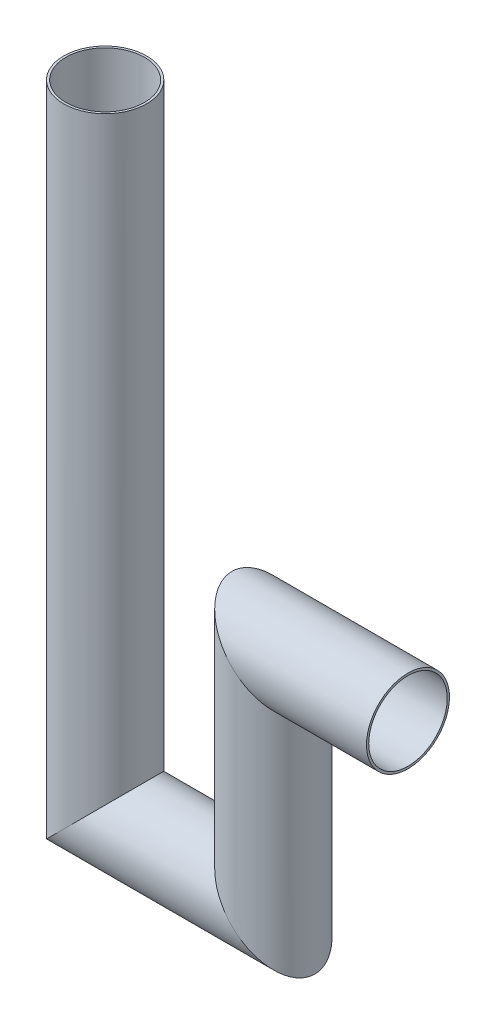
ISO-10303-21;
HEADER;
FILE_DESCRIPTION(('STEP AP214'),'2;1');
FILE_NAME('part.step','',(''),(''),'','','');
FILE_SCHEMA(('AUTOMOTIVE_DESIGN { 1 0 10303 214 1 1 1 1 }'));
ENDSEC;
DATA;
#1=APPLICATION_CONTEXT('core data for automotive mechanical design processes');
#2=APPLICATION_PROTOCOL_DEFINITION('international standard','automotive_design',2000,#1);
#3=PRODUCT_CONTEXT('',#1,'mechanical');
#4=PRODUCT('Part','Part','',(#3));
#5=PRODUCT_RELATED_PRODUCT_CATEGORY('part','',(#4));
#6=PRODUCT_DEFINITION_FORMATION('','',#4);
#7=PRODUCT_DEFINITION_CONTEXT('part definition',#1,'design');
#8=PRODUCT_DEFINITION('design','',#6,#7);
#9=PRODUCT_DEFINITION_SHAPE('','',#8);
#10=(LENGTH_UNIT() NAMED_UNIT(*) SI_UNIT(.MILLI.,.METRE.));
#11=(NAMED_UNIT(*) PLANE_ANGLE_UNIT() SI_UNIT($,.RADIAN.));
#12=(NAMED_UNIT(*) SI_UNIT($,.STERADIAN.) SOLID_ANGLE_UNIT());
#13=UNCERTAINTY_MEASURE_WITH_UNIT(LENGTH_MEASURE(1.E-05),#10,'distance_accuracy_value','');
#14=(GEOMETRIC_REPRESENTATION_CONTEXT(3) GLOBAL_UNCERTAINTY_ASSIGNED_CONTEXT((#13)) GLOBAL_UNIT_ASSIGNED_CONTEXT((#10,
#11,#12)) REPRESENTATION_CONTEXT('',''));
#15=CARTESIAN_POINT('',(0.,0.,0.));
#16=DIRECTION('',(0.,0.,1.));
#17=DIRECTION('',(1.,0.,0.));
#18=AXIS2_PLACEMENT_3D('',#15,#16,#17);
#19=CARTESIAN_POINT('',(87.0219999999998,-457.2,0.));
#20=DIRECTION('',(1.,0.,0.));
#21=DIRECTION('',(0.,0.,-1.));
#22=AXIS2_PLACEMENT_3D('',#19,#20,#21);
#23=CYLINDRICAL_SURFACE('',#22,46.99);
#24=CARTESIAN_POINT('',(190.5,-457.2,0.));
#25=DIRECTION('',(0.707106781186548,0.707106781186548,0.));
#26=DIRECTION('',(-0.707106781186548,0.707106781186548,0.));
#27=AXIS2_PLACEMENT_3D('',#24,#25,#26);
#28=ELLIPSE('',#27,66.4538952959117,46.99);
#29=CARTESIAN_POINT('',(143.51,-410.21,0.));
#30=VERTEX_POINT('',#29);
#31=EDGE_CURVE('E40',#30,#30,#28,.T.);
#32=ORIENTED_EDGE('',*,*,#31,.T.);
#33=EDGE_LOOP('',(#32));
#34=FACE_BOUND('',#33,.T.);
#35=CARTESIAN_POINT('',(342.9,-457.2,0.));
#36=DIRECTION('',(-1.,0.,0.));
#37=DIRECTION('',(0.,0.,1.));
#38=AXIS2_PLACEMENT_3D('',#35,#36,#37);
#39=CIRCLE('',#38,46.99);
#40=CARTESIAN_POINT('',(342.9,-457.2,46.99));
#41=VERTEX_POINT('',#40);
#42=EDGE_CURVE('E69',#41,#41,#39,.T.);
#43=ORIENTED_EDGE('',*,*,#42,.T.);
#44=EDGE_LOOP('',(#43));
#45=FACE_BOUND('',#44,.T.);
#46=ADVANCED_FACE('F37',(#34,#45),#23,.T.);
#47=CARTESIAN_POINT('',(190.5,-814.678,0.));
#48=DIRECTION('',(0.,1.,0.));
#49=DIRECTION('',(0.,0.,1.));
#50=AXIS2_PLACEMENT_3D('',#47,#48,#49);
#51=CYLINDRICAL_SURFACE('',#50,46.99);
#52=CARTESIAN_POINT('',(190.5,-711.2,0.));
#53=DIRECTION('',(0.707106781186547,0.707106781186547,0.));
#54=DIRECTION('',(0.707106781186548,-0.707106781186548,0.));
#55=AXIS2_PLACEMENT_3D('',#52,#53,#54);
#56=ELLIPSE('',#55,66.4538952959118,46.99);
#57=CARTESIAN_POINT('',(237.49,-758.19,0.));
#58=VERTEX_POINT('',#57);
#59=EDGE_CURVE('E76',#58,#58,#56,.T.);
#60=ORIENTED_EDGE('',*,*,#59,.T.);
#61=EDGE_LOOP('',(#60));
#62=FACE_BOUND('',#61,.T.);
#63=ORIENTED_EDGE('',*,*,#31,.F.);
#64=EDGE_LOOP('',(#63));
#65=FACE_BOUND('',#64,.T.);
#66=ADVANCED_FACE('F87',(#62,#65),#51,.T.);
#67=CARTESIAN_POINT('',(-103.478,-711.2,0.));
#68=DIRECTION('',(1.,0.,0.));
#69=DIRECTION('',(0.,0.,-1.));
#70=AXIS2_PLACEMENT_3D('',#67,#68,#69);
#71=CYLINDRICAL_SURFACE('',#70,46.99);
#72=CARTESIAN_POINT('',(0.,-711.2,0.));
#73=DIRECTION('',(0.707106781186548,-0.707106781186548,0.));
#74=DIRECTION('',(-0.707106781186548,-0.707106781186548,0.));
#75=AXIS2_PLACEMENT_3D('',#72,#73,#74);
#76=ELLIPSE('',#75,66.4538952959117,46.99);
#77=CARTESIAN_POINT('',(-46.99,-758.19,0.));
#78=VERTEX_POINT('',#77);
#79=EDGE_CURVE('E73',#78,#78,#76,.T.);
#80=ORIENTED_EDGE('',*,*,#79,.T.);
#81=EDGE_LOOP('',(#80));
#82=FACE_BOUND('',#81,.T.);
#83=ORIENTED_EDGE('',*,*,#59,.F.);
#84=EDGE_LOOP('',(#83));
#85=FACE_BOUND('',#84,.T.);
#86=ADVANCED_FACE('F89',(#82,#85),#71,.T.);
#87=CARTESIAN_POINT('',(0.,0.,0.));
#88=DIRECTION('',(0.,-1.,0.));
#89=DIRECTION('',(0.,0.,-1.));
#90=AXIS2_PLACEMENT_3D('',#87,#88,#89);
#91=CYLINDRICAL_SURFACE('',#90,46.99);
#92=CARTESIAN_POINT('',(0.,0.,0.));
#93=DIRECTION('',(0.,1.,0.));
#94=DIRECTION('',(0.,0.,1.));
#95=AXIS2_PLACEMENT_3D('',#92,#93,#94);
#96=CIRCLE('',#95,46.99);
#97=CARTESIAN_POINT('',(0.,0.,46.99));
#98=VERTEX_POINT('',#97);
#99=EDGE_CURVE('E65',#98,#98,#96,.T.);
#100=ORIENTED_EDGE('',*,*,#99,.F.);
#101=EDGE_LOOP('',(#100));
#102=FACE_BOUND('',#101,.T.);
#103=ORIENTED_EDGE('',*,*,#79,.F.);
#104=EDGE_LOOP('',(#103));
#105=FACE_BOUND('',#104,.T.);
#106=ADVANCED_FACE('F94',(#102,#105),#91,.T.);
#107=CARTESIAN_POINT('',(342.9,-457.2,0.));
#108=DIRECTION('',(-1.,0.,0.));
#109=DIRECTION('',(0.,0.,1.));
#110=AXIS2_PLACEMENT_3D('',#107,#108,#109);
#111=PLANE('',#110);
#112=CARTESIAN_POINT('',(342.9,-457.2,0.));
#113=DIRECTION('',(-1.,0.,0.));
#114=DIRECTION('',(0.,0.,1.));
#115=AXIS2_PLACEMENT_3D('',#112,#113,#114);
#116=CIRCLE('',#115,44.45);
#117=CARTESIAN_POINT('',(342.9,-457.2,44.45));
#118=VERTEX_POINT('',#117);
#119=EDGE_CURVE('E61',#118,#118,#116,.F.);
#120=ORIENTED_EDGE('',*,*,#119,.F.);
#121=EDGE_LOOP('',(#120));
#122=FACE_BOUND('',#121,.T.);
#123=ORIENTED_EDGE('',*,*,#42,.F.);
#124=EDGE_LOOP('',(#123));
#125=FACE_BOUND('',#124,.T.);
#126=ADVANCED_FACE('F120',(#122,#125),#111,.F.);
#127=CARTESIAN_POINT('',(0.,0.,0.));
#128=DIRECTION('',(0.,1.,0.));
#129=DIRECTION('',(0.,0.,1.));
#130=AXIS2_PLACEMENT_3D('',#127,#128,#129);
#131=PLANE('',#130);
#132=CARTESIAN_POINT('',(0.,0.,0.));
#133=DIRECTION('',(0.,1.,0.));
#134=DIRECTION('',(0.,0.,1.));
#135=AXIS2_PLACEMENT_3D('',#132,#133,#134);
#136=CIRCLE('',#135,44.45);
#137=CARTESIAN_POINT('',(0.,0.,44.45));
#138=VERTEX_POINT('',#137);
#139=EDGE_CURVE('E45',#138,#138,#136,.F.);
#140=ORIENTED_EDGE('',*,*,#139,.T.);
#141=EDGE_LOOP('',(#140));
#142=FACE_BOUND('',#141,.T.);
#143=ORIENTED_EDGE('',*,*,#99,.T.);
#144=EDGE_LOOP('',(#143));
#145=FACE_BOUND('',#144,.T.);
#146=ADVANCED_FACE('F116',(#142,#145),#131,.T.);
#147=CARTESIAN_POINT('',(92.6099999999999,-457.2,0.));
#148=DIRECTION('',(1.,0.,0.));
#149=DIRECTION('',(0.,0.,-1.));
#150=AXIS2_PLACEMENT_3D('',#147,#148,#149);
#151=CYLINDRICAL_SURFACE('',#150,44.45);
#152=CARTESIAN_POINT('',(190.5,-457.2,0.));
#153=DIRECTION('',(0.707106781186547,0.707106781186547,0.));
#154=DIRECTION('',(-0.707106781186548,0.707106781186548,0.));
#155=AXIS2_PLACEMENT_3D('',#152,#153,#154);
#156=ELLIPSE('',#155,62.8617928474841,44.45);
#157=CARTESIAN_POINT('',(146.05,-412.75,0.));
#158=VERTEX_POINT('',#157);
#159=EDGE_CURVE('E57',#158,#158,#156,.F.);
#160=ORIENTED_EDGE('',*,*,#159,.T.);
#161=EDGE_LOOP('',(#160));
#162=FACE_BOUND('',#161,.T.);
#163=ORIENTED_EDGE('',*,*,#119,.T.);
#164=EDGE_LOOP('',(#163));
#165=FACE_BOUND('',#164,.T.);
#166=ADVANCED_FACE('F112',(#162,#165),#151,.F.);
#167=CARTESIAN_POINT('',(190.5,-809.09,0.));
#168=DIRECTION('',(0.,1.,0.));
#169=DIRECTION('',(0.,0.,1.));
#170=AXIS2_PLACEMENT_3D('',#167,#168,#169);
#171=CYLINDRICAL_SURFACE('',#170,44.45);
#172=CARTESIAN_POINT('',(190.5,-711.2,0.));
#173=DIRECTION('',(0.707106781186547,0.707106781186547,0.));
#174=DIRECTION('',(0.707106781186548,-0.707106781186548,0.));
#175=AXIS2_PLACEMENT_3D('',#172,#173,#174);
#176=ELLIPSE('',#175,62.8617928474841,44.45);
#177=CARTESIAN_POINT('',(234.95,-755.65,0.));
#178=VERTEX_POINT('',#177);
#179=EDGE_CURVE('E51',#178,#178,#176,.F.);
#180=ORIENTED_EDGE('',*,*,#179,.T.);
#181=EDGE_LOOP('',(#180));
#182=FACE_BOUND('',#181,.T.);
#183=ORIENTED_EDGE('',*,*,#159,.F.);
#184=EDGE_LOOP('',(#183));
#185=FACE_BOUND('',#184,.T.);
#186=ADVANCED_FACE('F105',(#182,#185),#171,.F.);
#187=CARTESIAN_POINT('',(-97.8899999999999,-711.2,0.));
#188=DIRECTION('',(1.,0.,0.));
#189=DIRECTION('',(0.,0.,-1.));
#190=AXIS2_PLACEMENT_3D('',#187,#188,#189);
#191=CYLINDRICAL_SURFACE('',#190,44.45);
#192=CARTESIAN_POINT('',(0.,-711.2,0.));
#193=DIRECTION('',(0.707106781186548,-0.707106781186548,0.));
#194=DIRECTION('',(-0.707106781186548,-0.707106781186548,0.));
#195=AXIS2_PLACEMENT_3D('',#192,#193,#194);
#196=ELLIPSE('',#195,62.8617928474841,44.45);
#197=CARTESIAN_POINT('',(-44.45,-755.65,0.));
#198=VERTEX_POINT('',#197);
#199=EDGE_CURVE('E10',#198,#198,#196,.F.);
#200=ORIENTED_EDGE('',*,*,#199,.T.);
#201=EDGE_LOOP('',(#200));
#202=FACE_BOUND('',#201,.T.);
#203=ORIENTED_EDGE('',*,*,#179,.F.);
#204=EDGE_LOOP('',(#203));
#205=FACE_BOUND('',#204,.T.);
#206=ADVANCED_FACE('F99',(#202,#205),#191,.F.);
#207=CARTESIAN_POINT('',(0.,0.,0.));
#208=DIRECTION('',(0.,-1.,0.));
#209=DIRECTION('',(0.,0.,-1.));
#210=AXIS2_PLACEMENT_3D('',#207,#208,#209);
#211=CYLINDRICAL_SURFACE('',#210,44.45);
#212=ORIENTED_EDGE('',*,*,#139,.F.);
#213=EDGE_LOOP('',(#212));
#214=FACE_BOUND('',#213,.T.);
#215=ORIENTED_EDGE('',*,*,#199,.F.);
#216=EDGE_LOOP('',(#215));
#217=FACE_BOUND('',#216,.T.);
#218=ADVANCED_FACE('F97',(#214,#217),#211,.F.);
#219=CLOSED_SHELL('',(#46,#66,#86,#106,#126,#146,#166,#186,#206,#218));
#220=MANIFOLD_SOLID_BREP('B2',#219);
#221=ADVANCED_BREP_SHAPE_REPRESENTATION('',(#18,#220),#14);
#222=SHAPE_DEFINITION_REPRESENTATION(#9,#221);
ENDSEC;
END-ISO-10303-21;
